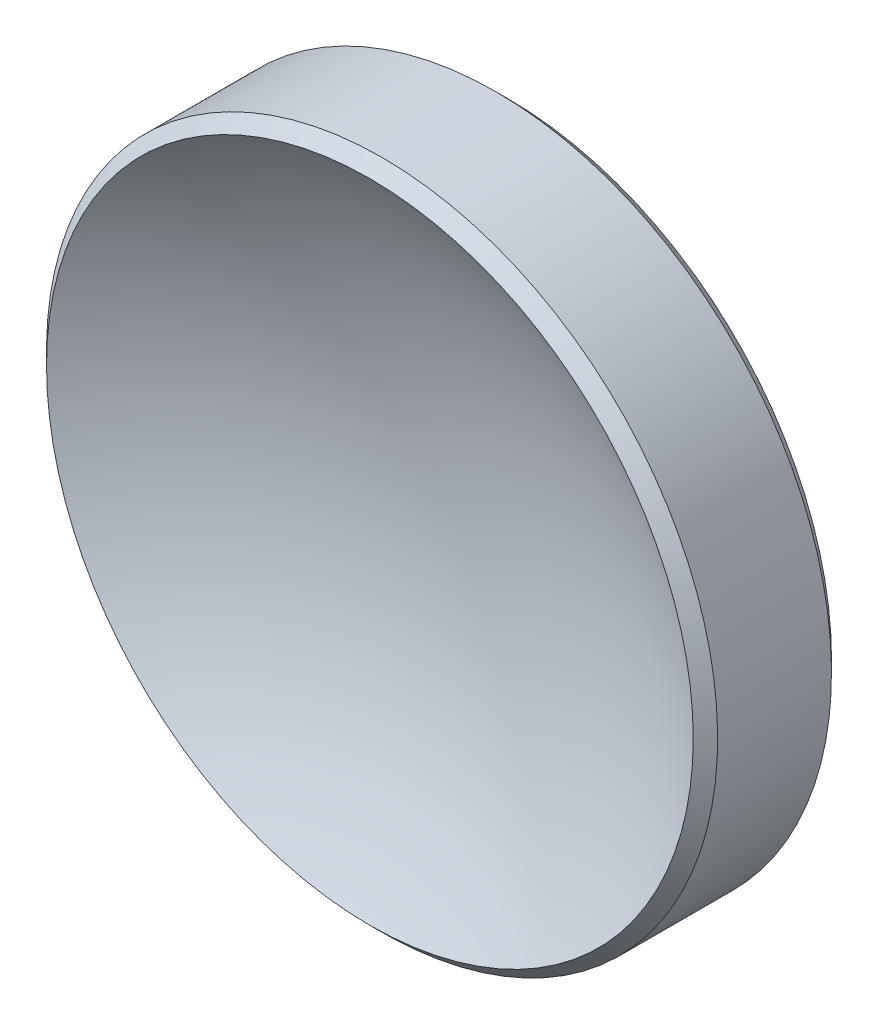
ISO-10303-21;
HEADER;
FILE_DESCRIPTION(('STEP AP214'),'2;1');
FILE_NAME('part.step','',(''),(''),'','','');
FILE_SCHEMA(('AUTOMOTIVE_DESIGN { 1 0 10303 214 1 1 1 1 }'));
ENDSEC;
DATA;
#1=APPLICATION_CONTEXT('core data for automotive mechanical design processes');
#2=APPLICATION_PROTOCOL_DEFINITION('international standard','automotive_design',2000,#1);
#3=PRODUCT_CONTEXT('',#1,'mechanical');
#4=PRODUCT('Part','Part','',(#3));
#5=PRODUCT_RELATED_PRODUCT_CATEGORY('part','',(#4));
#6=PRODUCT_DEFINITION_FORMATION('','',#4);
#7=PRODUCT_DEFINITION_CONTEXT('part definition',#1,'design');
#8=PRODUCT_DEFINITION('design','',#6,#7);
#9=PRODUCT_DEFINITION_SHAPE('','',#8);
#10=(LENGTH_UNIT() NAMED_UNIT(*) SI_UNIT(.MILLI.,.METRE.));
#11=(NAMED_UNIT(*) PLANE_ANGLE_UNIT() SI_UNIT($,.RADIAN.));
#12=(NAMED_UNIT(*) SI_UNIT($,.STERADIAN.) SOLID_ANGLE_UNIT());
#13=UNCERTAINTY_MEASURE_WITH_UNIT(LENGTH_MEASURE(1.E-05),#10,'distance_accuracy_value','');
#14=(GEOMETRIC_REPRESENTATION_CONTEXT(3) GLOBAL_UNCERTAINTY_ASSIGNED_CONTEXT((#13)) GLOBAL_UNIT_ASSIGNED_CONTEXT((#10,
#11,#12)) REPRESENTATION_CONTEXT('',''));
#15=CARTESIAN_POINT('',(0.,0.,0.));
#16=DIRECTION('',(0.,0.,1.));
#17=DIRECTION('',(1.,0.,0.));
#18=AXIS2_PLACEMENT_3D('',#15,#16,#17);
#19=CARTESIAN_POINT('',(0.,0.,12.9485331816946));
#20=DIRECTION('',(1.,0.,0.));
#21=DIRECTION('',(0.,-1.,0.));
#22=AXIS2_PLACEMENT_3D('',#19,#20,#21);
#23=SPHERICAL_SURFACE('',#22,25.2);
#24=CARTESIAN_POINT('',(0.,0.,12.9485331816946));
#25=DIRECTION('',(0.,0.,1.));
#26=DIRECTION('',(0.,-1.,0.));
#27=AXIS2_PLACEMENT_3D('',#24,#25,#26);
#28=SPHERICAL_SURFACE('',#27,25.2);
#29=CARTESIAN_POINT('',(0.,0.,-11.6878220682201));
#30=DIRECTION('',(0.,0.,1.));
#31=DIRECTION('',(0.,-1.,0.));
#32=AXIS2_PLACEMENT_3D('',#29,#30,#31);
#33=CIRCLE('',#32,5.3);
#34=CARTESIAN_POINT('',(0.,5.3,-11.6878220682201));
#35=VERTEX_POINT('',#34);
#36=EDGE_CURVE('E11',#35,#35,#33,.T.);
#37=ORIENTED_EDGE('',*,*,#36,.F.);
#38=EDGE_LOOP('',(#37));
#39=FACE_BOUND('',#38,.T.);
#40=ADVANCED_FACE('F16',(#39),#28,.T.);
#41=CARTESIAN_POINT('',(0.,0.,-11.6878220682201));
#42=DIRECTION('',(0.,0.,1.));
#43=DIRECTION('',(0.,-1.,0.));
#44=AXIS2_PLACEMENT_3D('',#41,#42,#43);
#45=CONICAL_SURFACE('',#44,5.3,0.785398163397452);
#46=CARTESIAN_POINT('',(0.,0.,-11.4878220682201));
#47=DIRECTION('',(0.,0.,1.));
#48=DIRECTION('',(0.,-1.,0.));
#49=AXIS2_PLACEMENT_3D('',#46,#47,#48);
#50=CIRCLE('',#49,5.5);
#51=CARTESIAN_POINT('',(0.,5.5,-11.4878220682201));
#52=VERTEX_POINT('',#51);
#53=EDGE_CURVE('E26',#52,#52,#50,.T.);
#54=ORIENTED_EDGE('',*,*,#53,.F.);
#55=EDGE_LOOP('',(#54));
#56=FACE_BOUND('',#55,.T.);
#57=ORIENTED_EDGE('',*,*,#36,.T.);
#58=EDGE_LOOP('',(#57));
#59=FACE_BOUND('',#58,.T.);
#60=ADVANCED_FACE('F76',(#56,#59),#45,.T.);
#61=CARTESIAN_POINT('',(0.,0.,-11.0514668183054));
#62=DIRECTION('',(0.,0.,1.));
#63=DIRECTION('',(0.,-1.,0.));
#64=AXIS2_PLACEMENT_3D('',#61,#62,#63);
#65=CYLINDRICAL_SURFACE('',#64,5.5);
#66=CARTESIAN_POINT('',(0.,0.,-9.62176669720282));
#67=DIRECTION('',(0.,0.,1.));
#68=DIRECTION('',(0.,-1.,0.));
#69=AXIS2_PLACEMENT_3D('',#66,#67,#68);
#70=CIRCLE('',#69,5.5);
#71=CARTESIAN_POINT('',(0.,5.5,-9.62176669720282));
#72=VERTEX_POINT('',#71);
#73=EDGE_CURVE('E53',#72,#72,#70,.T.);
#74=ORIENTED_EDGE('',*,*,#73,.F.);
#75=EDGE_LOOP('',(#74));
#76=FACE_BOUND('',#75,.T.);
#77=ORIENTED_EDGE('',*,*,#53,.T.);
#78=EDGE_LOOP('',(#77));
#79=FACE_BOUND('',#78,.T.);
#80=ADVANCED_FACE('F71',(#76,#79),#65,.T.);
#81=CARTESIAN_POINT('',(0.,0.,-9.62176669720282));
#82=DIRECTION('',(0.,0.,-1.));
#83=DIRECTION('',(0.,1.,0.));
#84=AXIS2_PLACEMENT_3D('',#81,#82,#83);
#85=CONICAL_SURFACE('',#84,5.5,0.785398163397452);
#86=ORIENTED_EDGE('',*,*,#73,.T.);
#87=EDGE_LOOP('',(#86));
#88=FACE_BOUND('',#87,.T.);
#89=CARTESIAN_POINT('',(0.,0.,-9.42176669720282));
#90=DIRECTION('',(0.,0.,1.));
#91=DIRECTION('',(0.,-1.,0.));
#92=AXIS2_PLACEMENT_3D('',#89,#90,#91);
#93=CIRCLE('',#92,5.3);
#94=CARTESIAN_POINT('',(0.,-5.3,-9.42176669720282));
#95=VERTEX_POINT('',#94);
#96=EDGE_CURVE('E19',#95,#95,#93,.T.);
#97=ORIENTED_EDGE('',*,*,#96,.F.);
#98=EDGE_LOOP('',(#97));
#99=FACE_BOUND('',#98,.T.);
#100=ADVANCED_FACE('F54',(#88,#99),#85,.T.);
#101=CARTESIAN_POINT('',(0.,0.,-1.61846681830543));
#102=DIRECTION('',(-1.,0.,0.));
#103=DIRECTION('',(0.,1.,0.));
#104=AXIS2_PLACEMENT_3D('',#101,#102,#103);
#105=SPHERICAL_SURFACE('',#104,9.433);
#106=CARTESIAN_POINT('',(0.,0.,-1.61846681830543));
#107=DIRECTION('',(0.,0.,1.));
#108=DIRECTION('',(0.,-1.,0.));
#109=AXIS2_PLACEMENT_3D('',#106,#107,#108);
#110=SPHERICAL_SURFACE('',#109,9.433);
#111=ORIENTED_EDGE('',*,*,#96,.T.);
#112=EDGE_LOOP('',(#111));
#113=FACE_BOUND('',#112,.T.);
#114=ADVANCED_FACE('F97',(#113),#110,.F.);
#115=CLOSED_SHELL('',(#40,#60,#80,#100,#114));
#116=MANIFOLD_SOLID_BREP('B1',#115);
#117=ADVANCED_BREP_SHAPE_REPRESENTATION('',(#18,#116),#14);
#118=SHAPE_DEFINITION_REPRESENTATION(#9,#117);
ENDSEC;
END-ISO-10303-21;
